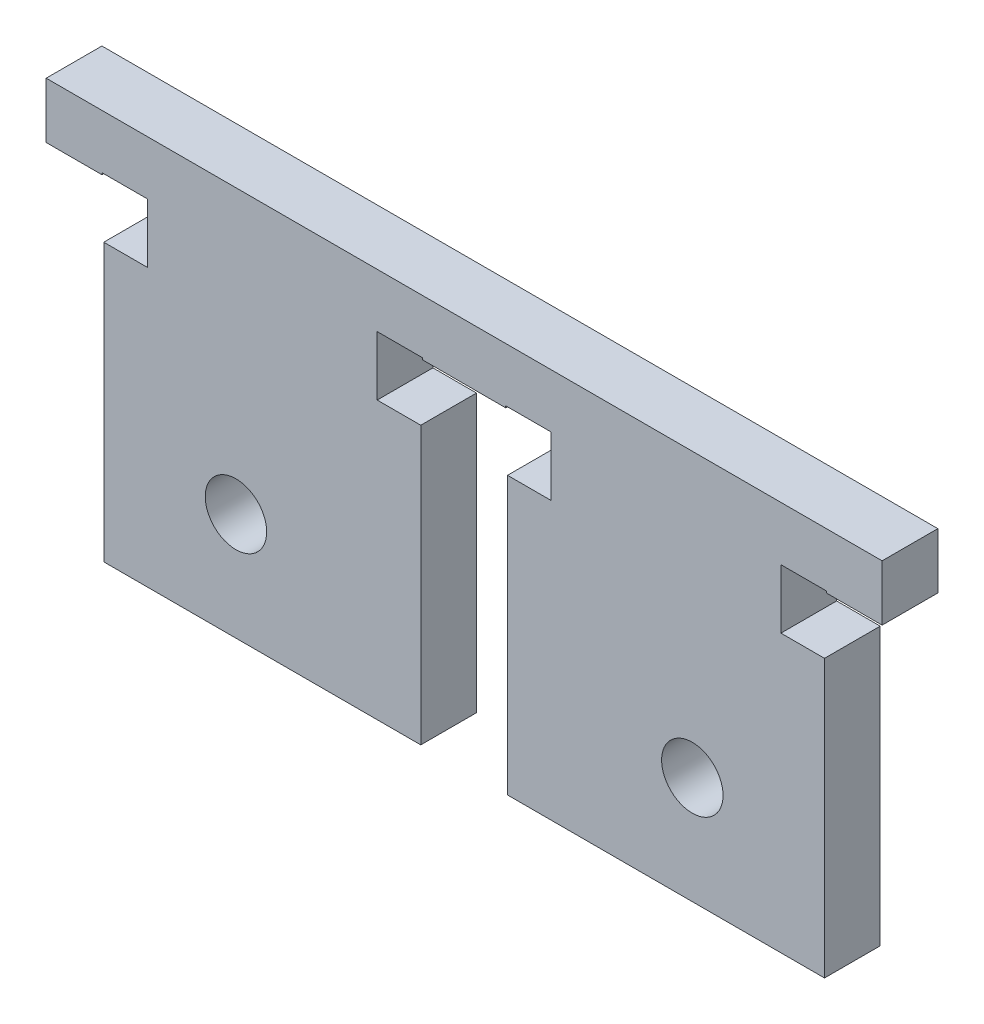
ISO-10303-21;
HEADER;
FILE_DESCRIPTION(('STEP AP214'),'2;1');
FILE_NAME('part.step','',(''),(''),'','','');
FILE_SCHEMA(('AUTOMOTIVE_DESIGN { 1 0 10303 214 1 1 1 1 }'));
ENDSEC;
DATA;
#1=APPLICATION_CONTEXT('core data for automotive mechanical design processes');
#2=APPLICATION_PROTOCOL_DEFINITION('international standard','automotive_design',2000,#1);
#3=PRODUCT_CONTEXT('',#1,'mechanical');
#4=PRODUCT('Part','Part','',(#3));
#5=PRODUCT_RELATED_PRODUCT_CATEGORY('part','',(#4));
#6=PRODUCT_DEFINITION_FORMATION('','',#4);
#7=PRODUCT_DEFINITION_CONTEXT('part definition',#1,'design');
#8=PRODUCT_DEFINITION('design','',#6,#7);
#9=PRODUCT_DEFINITION_SHAPE('','',#8);
#10=(LENGTH_UNIT() NAMED_UNIT(*) SI_UNIT(.MILLI.,.METRE.));
#11=(NAMED_UNIT(*) PLANE_ANGLE_UNIT() SI_UNIT($,.RADIAN.));
#12=(NAMED_UNIT(*) SI_UNIT($,.STERADIAN.) SOLID_ANGLE_UNIT());
#13=UNCERTAINTY_MEASURE_WITH_UNIT(LENGTH_MEASURE(1.E-05),#10,'distance_accuracy_value','');
#14=(GEOMETRIC_REPRESENTATION_CONTEXT(3) GLOBAL_UNCERTAINTY_ASSIGNED_CONTEXT((#13)) GLOBAL_UNIT_ASSIGNED_CONTEXT((#10,
#11,#12)) REPRESENTATION_CONTEXT('',''));
#15=CARTESIAN_POINT('',(0.,0.,0.));
#16=DIRECTION('',(0.,0.,1.));
#17=DIRECTION('',(1.,0.,0.));
#18=AXIS2_PLACEMENT_3D('',#15,#16,#17);
#19=CARTESIAN_POINT('',(0.,0.,6.35));
#20=DIRECTION('',(0.,0.,-1.));
#21=DIRECTION('',(-1.,0.,0.));
#22=AXIS2_PLACEMENT_3D('',#19,#20,#21);
#23=PLANE('',#22);
#24=CARTESIAN_POINT('',(-26.,-10.6279000000022,6.35));
#25=DIRECTION('',(0.,0.,1.));
#26=DIRECTION('',(1.,0.,0.));
#27=AXIS2_PLACEMENT_3D('',#24,#25,#26);
#28=CIRCLE('',#27,3.49999999999999);
#29=CARTESIAN_POINT('',(-22.5,-10.6279000000022,6.35));
#30=VERTEX_POINT('',#29);
#31=EDGE_CURVE('E695',#30,#30,#28,.T.);
#32=ORIENTED_EDGE('',*,*,#31,.F.);
#33=EDGE_LOOP('',(#32));
#34=FACE_BOUND('',#33,.T.);
#35=CARTESIAN_POINT('',(26.,-10.6279000000022,6.35));
#36=DIRECTION('',(0.,0.,1.));
#37=DIRECTION('',(1.,0.,0.));
#38=AXIS2_PLACEMENT_3D('',#35,#36,#37);
#39=CIRCLE('',#38,3.49999999999999);
#40=CARTESIAN_POINT('',(29.5,-10.6279000000022,6.35));
#41=VERTEX_POINT('',#40);
#42=EDGE_CURVE('E697',#41,#41,#39,.T.);
#43=ORIENTED_EDGE('',*,*,#42,.F.);
#44=EDGE_LOOP('',(#43));
#45=FACE_BOUND('',#44,.T.);
#46=DIRECTION('',(-1.,0.,0.));
#47=VECTOR('',#46,1.);
#48=CARTESIAN_POINT('',(-41.06164,-22.86,6.35));
#49=LINE('',#48,#47);
#50=CARTESIAN_POINT('',(41.06164,-22.86,6.35));
#51=VERTEX_POINT('',#50);
#52=CARTESIAN_POINT('',(4.94184939999999,-22.86,6.35));
#53=VERTEX_POINT('',#52);
#54=EDGE_CURVE('E58',#51,#53,#49,.T.);
#55=ORIENTED_EDGE('',*,*,#54,.F.);
#56=DIRECTION('',(0.,-1.,0.));
#57=VECTOR('',#56,1.);
#58=CARTESIAN_POINT('',(41.06164,0.,6.35));
#59=LINE('',#58,#57);
#60=CARTESIAN_POINT('',(41.06164,8.68679999999999,6.35));
#61=VERTEX_POINT('',#60);
#62=EDGE_CURVE('E271',#61,#51,#59,.T.);
#63=ORIENTED_EDGE('',*,*,#62,.F.);
#64=DIRECTION('',(-1.,0.,0.));
#65=VECTOR('',#64,1.);
#66=CARTESIAN_POINT('',(0.,8.68679999999999,6.35));
#67=LINE('',#66,#65);
#68=CARTESIAN_POINT('',(36.09594,8.68679999999999,6.35));
#69=VERTEX_POINT('',#68);
#70=EDGE_CURVE('E368',#61,#69,#67,.T.);
#71=ORIENTED_EDGE('',*,*,#70,.T.);
#72=DIRECTION('',(0.,-1.,0.));
#73=VECTOR('',#72,1.);
#74=CARTESIAN_POINT('',(36.09594,0.,6.35));
#75=LINE('',#74,#73);
#76=CARTESIAN_POINT('',(36.09594,15.4432,6.35));
#77=VERTEX_POINT('',#76);
#78=EDGE_CURVE('E365',#77,#69,#75,.T.);
#79=ORIENTED_EDGE('',*,*,#78,.F.);
#80=DIRECTION('',(-1.,0.,0.));
#81=VECTOR('',#80,1.);
#82=CARTESIAN_POINT('',(0.,15.4432,6.35));
#83=LINE('',#82,#81);
#84=CARTESIAN_POINT('',(41.26484,15.4432,6.35));
#85=VERTEX_POINT('',#84);
#86=EDGE_CURVE('E357',#85,#77,#83,.T.);
#87=ORIENTED_EDGE('',*,*,#86,.F.);
#88=DIRECTION('',(0.,-1.,0.));
#89=VECTOR('',#88,1.);
#90=CARTESIAN_POINT('',(41.26484,0.,6.35));
#91=LINE('',#90,#89);
#92=CARTESIAN_POINT('',(41.26484,15.24,6.35));
#93=VERTEX_POINT('',#92);
#94=EDGE_CURVE('E372',#85,#93,#91,.T.);
#95=ORIENTED_EDGE('',*,*,#94,.T.);
#96=DIRECTION('',(1.,0.,0.));
#97=VECTOR('',#96,1.);
#98=CARTESIAN_POINT('',(0.,15.24,6.35));
#99=LINE('',#98,#97);
#100=CARTESIAN_POINT('',(47.625,15.24,6.35));
#101=VERTEX_POINT('',#100);
#102=EDGE_CURVE('E273',#93,#101,#99,.T.);
#103=ORIENTED_EDGE('',*,*,#102,.T.);
#104=DIRECTION('',(0.,1.,0.));
#105=VECTOR('',#104,1.);
#106=CARTESIAN_POINT('',(47.625,-30.48,6.35));
#107=LINE('',#106,#105);
#108=CARTESIAN_POINT('',(47.625,21.59,6.35));
#109=VERTEX_POINT('',#108);
#110=EDGE_CURVE('E293',#101,#109,#107,.T.);
#111=ORIENTED_EDGE('',*,*,#110,.T.);
#112=DIRECTION('',(1.,0.,0.));
#113=VECTOR('',#112,1.);
#114=CARTESIAN_POINT('',(-47.625,21.59,6.35));
#115=LINE('',#114,#113);
#116=CARTESIAN_POINT('',(-47.625,21.59,6.35));
#117=VERTEX_POINT('',#116);
#118=EDGE_CURVE('E510',#117,#109,#115,.T.);
#119=ORIENTED_EDGE('',*,*,#118,.F.);
#120=DIRECTION('',(0.,-1.,0.));
#121=VECTOR('',#120,1.);
#122=CARTESIAN_POINT('',(-47.625,-30.48,6.35));
#123=LINE('',#122,#121);
#124=CARTESIAN_POINT('',(-47.625,15.24,6.35));
#125=VERTEX_POINT('',#124);
#126=EDGE_CURVE('E296',#117,#125,#123,.T.);
#127=ORIENTED_EDGE('',*,*,#126,.T.);
#128=DIRECTION('',(1.,0.,0.));
#129=VECTOR('',#128,1.);
#130=CARTESIAN_POINT('',(0.,15.24,6.35));
#131=LINE('',#130,#129);
#132=CARTESIAN_POINT('',(-41.26484,15.24,6.35));
#133=VERTEX_POINT('',#132);
#134=EDGE_CURVE('E251',#125,#133,#131,.T.);
#135=ORIENTED_EDGE('',*,*,#134,.T.);
#136=DIRECTION('',(0.,-1.,0.));
#137=VECTOR('',#136,1.);
#138=CARTESIAN_POINT('',(-41.26484,0.,6.35));
#139=LINE('',#138,#137);
#140=CARTESIAN_POINT('',(-41.26484,15.4432,6.35));
#141=VERTEX_POINT('',#140);
#142=EDGE_CURVE('E424',#141,#133,#139,.T.);
#143=ORIENTED_EDGE('',*,*,#142,.F.);
#144=DIRECTION('',(1.,0.,0.));
#145=VECTOR('',#144,1.);
#146=CARTESIAN_POINT('',(0.,15.4432,6.35));
#147=LINE('',#146,#145);
#148=CARTESIAN_POINT('',(-36.09594,15.4432,6.35));
#149=VERTEX_POINT('',#148);
#150=EDGE_CURVE('E421',#141,#149,#147,.T.);
#151=ORIENTED_EDGE('',*,*,#150,.T.);
#152=DIRECTION('',(0.,-1.,0.));
#153=VECTOR('',#152,1.);
#154=CARTESIAN_POINT('',(-36.09594,0.,6.35));
#155=LINE('',#154,#153);
#156=CARTESIAN_POINT('',(-36.09594,8.68679999999999,6.35));
#157=VERTEX_POINT('',#156);
#158=EDGE_CURVE('E347',#149,#157,#155,.T.);
#159=ORIENTED_EDGE('',*,*,#158,.T.);
#160=DIRECTION('',(1.,0.,0.));
#161=VECTOR('',#160,1.);
#162=CARTESIAN_POINT('',(0.,8.68679999999999,6.35));
#163=LINE('',#162,#161);
#164=CARTESIAN_POINT('',(-41.06164,8.68679999999999,6.35));
#165=VERTEX_POINT('',#164);
#166=EDGE_CURVE('E412',#165,#157,#163,.T.);
#167=ORIENTED_EDGE('',*,*,#166,.F.);
#168=DIRECTION('',(0.,-1.,0.));
#169=VECTOR('',#168,1.);
#170=CARTESIAN_POINT('',(-41.06164,0.,6.35));
#171=LINE('',#170,#169);
#172=CARTESIAN_POINT('',(-41.06164,-22.86,6.35));
#173=VERTEX_POINT('',#172);
#174=EDGE_CURVE('E257',#165,#173,#171,.T.);
#175=ORIENTED_EDGE('',*,*,#174,.T.);
#176=CARTESIAN_POINT('',(-4.94184940000002,-22.86,6.35));
#177=VERTEX_POINT('',#176);
#178=EDGE_CURVE('E66',#177,#173,#49,.T.);
#179=ORIENTED_EDGE('',*,*,#178,.F.);
#180=DIRECTION('',(0.,1.,0.));
#181=VECTOR('',#180,1.);
#182=CARTESIAN_POINT('',(-4.94184940000001,0.,6.35));
#183=LINE('',#182,#181);
#184=CARTESIAN_POINT('',(-4.94184940000001,8.68680000000001,6.35));
#185=VERTEX_POINT('',#184);
#186=EDGE_CURVE('E282',#177,#185,#183,.T.);
#187=ORIENTED_EDGE('',*,*,#186,.T.);
#188=DIRECTION('',(-1.,0.,0.));
#189=VECTOR('',#188,1.);
#190=CARTESIAN_POINT('',(0.,8.68680000000001,6.35));
#191=LINE('',#190,#189);
#192=CARTESIAN_POINT('',(-9.90754940000001,8.68680000000001,6.35));
#193=VERTEX_POINT('',#192);
#194=EDGE_CURVE('E384',#185,#193,#191,.T.);
#195=ORIENTED_EDGE('',*,*,#194,.T.);
#196=DIRECTION('',(0.,-1.,0.));
#197=VECTOR('',#196,1.);
#198=CARTESIAN_POINT('',(-9.90754940000001,0.,6.35));
#199=LINE('',#198,#197);
#200=CARTESIAN_POINT('',(-9.90754940000001,15.4432,6.35));
#201=VERTEX_POINT('',#200);
#202=EDGE_CURVE('E400',#201,#193,#199,.T.);
#203=ORIENTED_EDGE('',*,*,#202,.F.);
#204=DIRECTION('',(-1.,0.,0.));
#205=VECTOR('',#204,1.);
#206=CARTESIAN_POINT('',(0.,15.4432,6.35));
#207=LINE('',#206,#205);
#208=CARTESIAN_POINT('',(-4.73864940000001,15.4432,6.35));
#209=VERTEX_POINT('',#208);
#210=EDGE_CURVE('E396',#209,#201,#207,.T.);
#211=ORIENTED_EDGE('',*,*,#210,.F.);
#212=DIRECTION('',(0.,-1.,0.));
#213=VECTOR('',#212,1.);
#214=CARTESIAN_POINT('',(-4.73864940000001,0.,6.35));
#215=LINE('',#214,#213);
#216=CARTESIAN_POINT('',(-4.73864940000001,15.24,6.35));
#217=VERTEX_POINT('',#216);
#218=EDGE_CURVE('E393',#209,#217,#215,.T.);
#219=ORIENTED_EDGE('',*,*,#218,.T.);
#220=DIRECTION('',(1.,0.,0.));
#221=VECTOR('',#220,1.);
#222=CARTESIAN_POINT('',(0.,15.24,6.35));
#223=LINE('',#222,#221);
#224=CARTESIAN_POINT('',(4.73864940000001,15.24,6.35));
#225=VERTEX_POINT('',#224);
#226=EDGE_CURVE('E288',#217,#225,#223,.T.);
#227=ORIENTED_EDGE('',*,*,#226,.T.);
#228=DIRECTION('',(0.,-1.,0.));
#229=VECTOR('',#228,1.);
#230=CARTESIAN_POINT('',(4.73864940000001,0.,6.35));
#231=LINE('',#230,#229);
#232=CARTESIAN_POINT('',(4.73864940000001,15.4432,6.35));
#233=VERTEX_POINT('',#232);
#234=EDGE_CURVE('E335',#233,#225,#231,.T.);
#235=ORIENTED_EDGE('',*,*,#234,.F.);
#236=DIRECTION('',(1.,0.,0.));
#237=VECTOR('',#236,1.);
#238=CARTESIAN_POINT('',(0.,15.4432,6.35));
#239=LINE('',#238,#237);
#240=CARTESIAN_POINT('',(9.90754940000001,15.4432,6.35));
#241=VERTEX_POINT('',#240);
#242=EDGE_CURVE('E337',#233,#241,#239,.T.);
#243=ORIENTED_EDGE('',*,*,#242,.T.);
#244=DIRECTION('',(0.,-1.,0.));
#245=VECTOR('',#244,1.);
#246=CARTESIAN_POINT('',(9.90754940000001,0.,6.35));
#247=LINE('',#246,#245);
#248=CARTESIAN_POINT('',(9.90754940000001,8.68680000000001,6.35));
#249=VERTEX_POINT('',#248);
#250=EDGE_CURVE('E334',#241,#249,#247,.T.);
#251=ORIENTED_EDGE('',*,*,#250,.T.);
#252=DIRECTION('',(1.,0.,0.));
#253=VECTOR('',#252,1.);
#254=CARTESIAN_POINT('',(0.,8.68680000000001,6.35));
#255=LINE('',#254,#253);
#256=CARTESIAN_POINT('',(4.94184939999999,8.68680000000001,6.35));
#257=VERTEX_POINT('',#256);
#258=EDGE_CURVE('E326',#257,#249,#255,.T.);
#259=ORIENTED_EDGE('',*,*,#258,.F.);
#260=DIRECTION('',(0.,1.,0.));
#261=VECTOR('',#260,1.);
#262=CARTESIAN_POINT('',(4.94184939999999,0.,6.35));
#263=LINE('',#262,#261);
#264=EDGE_CURVE('E286',#53,#257,#263,.T.);
#265=ORIENTED_EDGE('',*,*,#264,.F.);
#266=EDGE_LOOP('',(#55,#63,#71,#79,#87,#95,#103,#111,#119,#127,#135,#143,#151,#159,#167,#175,
#179,#187,#195,#203,#211,#219,#227,#235,#243,#251,#259,#265));
#267=FACE_BOUND('',#266,.T.);
#268=ADVANCED_FACE('F43',(#34,#45,#267),#23,.F.);
#269=CARTESIAN_POINT('',(0.,0.,0.));
#270=DIRECTION('',(0.,0.,-1.));
#271=DIRECTION('',(-1.,0.,0.));
#272=AXIS2_PLACEMENT_3D('',#269,#270,#271);
#273=PLANE('',#272);
#274=CARTESIAN_POINT('',(-26.,-10.6279000000022,0.));
#275=DIRECTION('',(0.,0.,1.));
#276=DIRECTION('',(1.,0.,0.));
#277=AXIS2_PLACEMENT_3D('',#274,#275,#276);
#278=CIRCLE('',#277,3.5);
#279=CARTESIAN_POINT('',(-22.5,-10.6279000000022,0.));
#280=VERTEX_POINT('',#279);
#281=EDGE_CURVE('E693',#280,#280,#278,.T.);
#282=ORIENTED_EDGE('',*,*,#281,.T.);
#283=EDGE_LOOP('',(#282));
#284=FACE_BOUND('',#283,.T.);
#285=CARTESIAN_POINT('',(26.,-10.6279000000022,0.));
#286=DIRECTION('',(0.,0.,1.));
#287=DIRECTION('',(1.,0.,0.));
#288=AXIS2_PLACEMENT_3D('',#285,#286,#287);
#289=CIRCLE('',#288,3.5);
#290=CARTESIAN_POINT('',(29.5,-10.6279000000022,0.));
#291=VERTEX_POINT('',#290);
#292=EDGE_CURVE('E234',#291,#291,#289,.T.);
#293=ORIENTED_EDGE('',*,*,#292,.T.);
#294=EDGE_LOOP('',(#293));
#295=FACE_BOUND('',#294,.T.);
#296=DIRECTION('',(0.,-1.,0.));
#297=VECTOR('',#296,1.);
#298=CARTESIAN_POINT('',(41.06164,0.,0.));
#299=LINE('',#298,#297);
#300=CARTESIAN_POINT('',(41.06164,8.68679999999999,0.));
#301=VERTEX_POINT('',#300);
#302=CARTESIAN_POINT('',(41.06164,-22.86,0.));
#303=VERTEX_POINT('',#302);
#304=EDGE_CURVE('E270',#301,#303,#299,.T.);
#305=ORIENTED_EDGE('',*,*,#304,.T.);
#306=DIRECTION('',(1.,0.,0.));
#307=VECTOR('',#306,1.);
#308=CARTESIAN_POINT('',(-41.06164,-22.86,0.));
#309=LINE('',#308,#307);
#310=CARTESIAN_POINT('',(4.94184939999998,-22.86,0.));
#311=VERTEX_POINT('',#310);
#312=EDGE_CURVE('E233',#311,#303,#309,.T.);
#313=ORIENTED_EDGE('',*,*,#312,.F.);
#314=DIRECTION('',(0.,1.,0.));
#315=VECTOR('',#314,1.);
#316=CARTESIAN_POINT('',(4.94184939999999,0.,0.));
#317=LINE('',#316,#315);
#318=CARTESIAN_POINT('',(4.94184939999999,8.68680000000001,0.));
#319=VERTEX_POINT('',#318);
#320=EDGE_CURVE('E279',#311,#319,#317,.T.);
#321=ORIENTED_EDGE('',*,*,#320,.T.);
#322=DIRECTION('',(1.,0.,0.));
#323=VECTOR('',#322,1.);
#324=CARTESIAN_POINT('',(0.,8.68680000000001,0.));
#325=LINE('',#324,#323);
#326=CARTESIAN_POINT('',(9.90754940000001,8.68680000000001,0.));
#327=VERTEX_POINT('',#326);
#328=EDGE_CURVE('E329',#319,#327,#325,.T.);
#329=ORIENTED_EDGE('',*,*,#328,.T.);
#330=DIRECTION('',(0.,-1.,0.));
#331=VECTOR('',#330,1.);
#332=CARTESIAN_POINT('',(9.90754940000001,0.,0.));
#333=LINE('',#332,#331);
#334=CARTESIAN_POINT('',(9.90754940000001,15.4432,0.));
#335=VERTEX_POINT('',#334);
#336=EDGE_CURVE('E487',#335,#327,#333,.T.);
#337=ORIENTED_EDGE('',*,*,#336,.F.);
#338=DIRECTION('',(1.,0.,0.));
#339=VECTOR('',#338,1.);
#340=CARTESIAN_POINT('',(0.,15.4432,0.));
#341=LINE('',#340,#339);
#342=CARTESIAN_POINT('',(4.73864940000001,15.4432,0.));
#343=VERTEX_POINT('',#342);
#344=EDGE_CURVE('E352',#343,#335,#341,.T.);
#345=ORIENTED_EDGE('',*,*,#344,.F.);
#346=DIRECTION('',(0.,-1.,0.));
#347=VECTOR('',#346,1.);
#348=CARTESIAN_POINT('',(4.73864940000001,0.,0.));
#349=LINE('',#348,#347);
#350=CARTESIAN_POINT('',(4.73864940000001,15.24,0.));
#351=VERTEX_POINT('',#350);
#352=EDGE_CURVE('E344',#343,#351,#349,.T.);
#353=ORIENTED_EDGE('',*,*,#352,.T.);
#354=DIRECTION('',(1.,0.,0.));
#355=VECTOR('',#354,1.);
#356=CARTESIAN_POINT('',(0.,15.24,0.));
#357=LINE('',#356,#355);
#358=CARTESIAN_POINT('',(-4.73864940000001,15.24,0.));
#359=VERTEX_POINT('',#358);
#360=EDGE_CURVE('E281',#359,#351,#357,.T.);
#361=ORIENTED_EDGE('',*,*,#360,.F.);
#362=DIRECTION('',(0.,-1.,0.));
#363=VECTOR('',#362,1.);
#364=CARTESIAN_POINT('',(-4.73864940000001,0.,0.));
#365=LINE('',#364,#363);
#366=CARTESIAN_POINT('',(-4.73864940000001,15.4432,0.));
#367=VERTEX_POINT('',#366);
#368=EDGE_CURVE('E381',#367,#359,#365,.T.);
#369=ORIENTED_EDGE('',*,*,#368,.F.);
#370=DIRECTION('',(-1.,0.,0.));
#371=VECTOR('',#370,1.);
#372=CARTESIAN_POINT('',(0.,15.4432,0.));
#373=LINE('',#372,#371);
#374=CARTESIAN_POINT('',(-9.90754940000001,15.4432,0.));
#375=VERTEX_POINT('',#374);
#376=EDGE_CURVE('E383',#367,#375,#373,.T.);
#377=ORIENTED_EDGE('',*,*,#376,.T.);
#378=DIRECTION('',(0.,-1.,0.));
#379=VECTOR('',#378,1.);
#380=CARTESIAN_POINT('',(-9.90754940000001,0.,0.));
#381=LINE('',#380,#379);
#382=CARTESIAN_POINT('',(-9.90754940000001,8.68680000000001,0.));
#383=VERTEX_POINT('',#382);
#384=EDGE_CURVE('E387',#375,#383,#381,.T.);
#385=ORIENTED_EDGE('',*,*,#384,.T.);
#386=DIRECTION('',(-1.,0.,0.));
#387=VECTOR('',#386,1.);
#388=CARTESIAN_POINT('',(0.,8.68680000000001,0.));
#389=LINE('',#388,#387);
#390=CARTESIAN_POINT('',(-4.94184940000001,8.68680000000001,0.));
#391=VERTEX_POINT('',#390);
#392=EDGE_CURVE('E390',#391,#383,#389,.T.);
#393=ORIENTED_EDGE('',*,*,#392,.F.);
#394=DIRECTION('',(0.,1.,0.));
#395=VECTOR('',#394,1.);
#396=CARTESIAN_POINT('',(-4.94184940000001,0.,0.));
#397=LINE('',#396,#395);
#398=CARTESIAN_POINT('',(-4.94184940000002,-22.86,0.));
#399=VERTEX_POINT('',#398);
#400=EDGE_CURVE('E244',#399,#391,#397,.T.);
#401=ORIENTED_EDGE('',*,*,#400,.F.);
#402=CARTESIAN_POINT('',(-41.06164,-22.86,0.));
#403=VERTEX_POINT('',#402);
#404=EDGE_CURVE('E227',#403,#399,#309,.T.);
#405=ORIENTED_EDGE('',*,*,#404,.F.);
#406=DIRECTION('',(0.,-1.,0.));
#407=VECTOR('',#406,1.);
#408=CARTESIAN_POINT('',(-41.06164,0.,0.));
#409=LINE('',#408,#407);
#410=CARTESIAN_POINT('',(-41.06164,8.68679999999999,0.));
#411=VERTEX_POINT('',#410);
#412=EDGE_CURVE('E242',#411,#403,#409,.T.);
#413=ORIENTED_EDGE('',*,*,#412,.F.);
#414=DIRECTION('',(1.,0.,0.));
#415=VECTOR('',#414,1.);
#416=CARTESIAN_POINT('',(0.,8.68679999999999,0.));
#417=LINE('',#416,#415);
#418=CARTESIAN_POINT('',(-36.09594,8.68679999999999,0.));
#419=VERTEX_POINT('',#418);
#420=EDGE_CURVE('E417',#411,#419,#417,.T.);
#421=ORIENTED_EDGE('',*,*,#420,.T.);
#422=DIRECTION('',(0.,-1.,0.));
#423=VECTOR('',#422,1.);
#424=CARTESIAN_POINT('',(-36.09594,0.,0.));
#425=LINE('',#424,#423);
#426=CARTESIAN_POINT('',(-36.09594,15.4432,0.));
#427=VERTEX_POINT('',#426);
#428=EDGE_CURVE('E409',#427,#419,#425,.T.);
#429=ORIENTED_EDGE('',*,*,#428,.F.);
#430=DIRECTION('',(1.,0.,0.));
#431=VECTOR('',#430,1.);
#432=CARTESIAN_POINT('',(0.,15.4432,0.));
#433=LINE('',#432,#431);
#434=CARTESIAN_POINT('',(-41.26484,15.4432,0.));
#435=VERTEX_POINT('',#434);
#436=EDGE_CURVE('E411',#435,#427,#433,.T.);
#437=ORIENTED_EDGE('',*,*,#436,.F.);
#438=DIRECTION('',(0.,-1.,0.));
#439=VECTOR('',#438,1.);
#440=CARTESIAN_POINT('',(-41.26484,0.,0.));
#441=LINE('',#440,#439);
#442=CARTESIAN_POINT('',(-41.26484,15.24,0.));
#443=VERTEX_POINT('',#442);
#444=EDGE_CURVE('E414',#435,#443,#441,.T.);
#445=ORIENTED_EDGE('',*,*,#444,.T.);
#446=DIRECTION('',(1.,0.,0.));
#447=VECTOR('',#446,1.);
#448=CARTESIAN_POINT('',(0.,15.24,0.));
#449=LINE('',#448,#447);
#450=CARTESIAN_POINT('',(-47.625,15.24,0.));
#451=VERTEX_POINT('',#450);
#452=EDGE_CURVE('E250',#451,#443,#449,.T.);
#453=ORIENTED_EDGE('',*,*,#452,.F.);
#454=DIRECTION('',(0.,-1.,0.));
#455=VECTOR('',#454,1.);
#456=CARTESIAN_POINT('',(-47.625,-30.48,0.));
#457=LINE('',#456,#455);
#458=CARTESIAN_POINT('',(-47.625,21.59,0.));
#459=VERTEX_POINT('',#458);
#460=EDGE_CURVE('E297',#459,#451,#457,.T.);
#461=ORIENTED_EDGE('',*,*,#460,.F.);
#462=DIRECTION('',(-1.,0.,0.));
#463=VECTOR('',#462,1.);
#464=CARTESIAN_POINT('',(-47.625,21.59,0.));
#465=LINE('',#464,#463);
#466=CARTESIAN_POINT('',(47.625,21.59,0.));
#467=VERTEX_POINT('',#466);
#468=EDGE_CURVE('E369',#467,#459,#465,.T.);
#469=ORIENTED_EDGE('',*,*,#468,.F.);
#470=DIRECTION('',(0.,1.,0.));
#471=VECTOR('',#470,1.);
#472=CARTESIAN_POINT('',(47.625,-30.48,0.));
#473=LINE('',#472,#471);
#474=CARTESIAN_POINT('',(47.625,15.24,0.));
#475=VERTEX_POINT('',#474);
#476=EDGE_CURVE('E267',#475,#467,#473,.T.);
#477=ORIENTED_EDGE('',*,*,#476,.F.);
#478=DIRECTION('',(1.,0.,0.));
#479=VECTOR('',#478,1.);
#480=CARTESIAN_POINT('',(0.,15.24,0.));
#481=LINE('',#480,#479);
#482=CARTESIAN_POINT('',(41.26484,15.24,0.));
#483=VERTEX_POINT('',#482);
#484=EDGE_CURVE('E268',#483,#475,#481,.T.);
#485=ORIENTED_EDGE('',*,*,#484,.F.);
#486=DIRECTION('',(0.,-1.,0.));
#487=VECTOR('',#486,1.);
#488=CARTESIAN_POINT('',(41.26484,0.,0.));
#489=LINE('',#488,#487);
#490=CARTESIAN_POINT('',(41.26484,15.4432,0.));
#491=VERTEX_POINT('',#490);
#492=EDGE_CURVE('E359',#491,#483,#489,.T.);
#493=ORIENTED_EDGE('',*,*,#492,.F.);
#494=DIRECTION('',(-1.,0.,0.));
#495=VECTOR('',#494,1.);
#496=CARTESIAN_POINT('',(0.,15.4432,0.));
#497=LINE('',#496,#495);
#498=CARTESIAN_POINT('',(36.09594,15.4432,0.));
#499=VERTEX_POINT('',#498);
#500=EDGE_CURVE('E361',#491,#499,#497,.T.);
#501=ORIENTED_EDGE('',*,*,#500,.T.);
#502=DIRECTION('',(0.,-1.,0.));
#503=VECTOR('',#502,1.);
#504=CARTESIAN_POINT('',(36.09594,0.,0.));
#505=LINE('',#504,#503);
#506=CARTESIAN_POINT('',(36.09594,8.68679999999999,0.));
#507=VERTEX_POINT('',#506);
#508=EDGE_CURVE('E353',#499,#507,#505,.T.);
#509=ORIENTED_EDGE('',*,*,#508,.T.);
#510=DIRECTION('',(-1.,0.,0.));
#511=VECTOR('',#510,1.);
#512=CARTESIAN_POINT('',(0.,8.68679999999999,0.));
#513=LINE('',#512,#511);
#514=EDGE_CURVE('E356',#301,#507,#513,.T.);
#515=ORIENTED_EDGE('',*,*,#514,.F.);
#516=EDGE_LOOP('',(#305,#313,#321,#329,#337,#345,#353,#361,#369,#377,#385,#393,#401,#405,#413,
#421,#429,#437,#445,#453,#461,#469,#477,#485,#493,#501,#509,#515));
#517=FACE_BOUND('',#516,.T.);
#518=ADVANCED_FACE('F240',(#284,#295,#517),#273,.T.);
#519=CARTESIAN_POINT('',(41.06164,0.,0.));
#520=DIRECTION('',(-1.,0.,0.));
#521=DIRECTION('',(0.,-1.,0.));
#522=AXIS2_PLACEMENT_3D('',#519,#520,#521);
#523=PLANE('',#522);
#524=DIRECTION('',(0.,0.,1.));
#525=VECTOR('',#524,1.);
#526=CARTESIAN_POINT('',(41.06164,-22.86,6.35));
#527=LINE('',#526,#525);
#528=EDGE_CURVE('E245',#303,#51,#527,.T.);
#529=ORIENTED_EDGE('',*,*,#528,.F.);
#530=ORIENTED_EDGE('',*,*,#304,.F.);
#531=DIRECTION('',(0.,0.,-1.));
#532=VECTOR('',#531,1.);
#533=CARTESIAN_POINT('',(41.06164,8.68679999999999,0.));
#534=LINE('',#533,#532);
#535=EDGE_CURVE('E311',#61,#301,#534,.T.);
#536=ORIENTED_EDGE('',*,*,#535,.F.);
#537=ORIENTED_EDGE('',*,*,#62,.T.);
#538=EDGE_LOOP('',(#529,#530,#536,#537));
#539=FACE_BOUND('',#538,.T.);
#540=ADVANCED_FACE('F546',(#539),#523,.F.);
#541=CARTESIAN_POINT('',(-4.94184940000001,0.,0.));
#542=DIRECTION('',(1.,0.,0.));
#543=DIRECTION('',(0.,0.,-1.));
#544=AXIS2_PLACEMENT_3D('',#541,#542,#543);
#545=PLANE('',#544);
#546=ORIENTED_EDGE('',*,*,#186,.F.);
#547=DIRECTION('',(0.,0.,-1.));
#548=VECTOR('',#547,1.);
#549=CARTESIAN_POINT('',(-4.94184940000001,-22.86,0.));
#550=LINE('',#549,#548);
#551=EDGE_CURVE('E459',#177,#399,#550,.T.);
#552=ORIENTED_EDGE('',*,*,#551,.T.);
#553=ORIENTED_EDGE('',*,*,#400,.T.);
#554=DIRECTION('',(0.,0.,1.));
#555=VECTOR('',#554,1.);
#556=CARTESIAN_POINT('',(-4.94184940000001,8.68680000000001,0.));
#557=LINE('',#556,#555);
#558=EDGE_CURVE('E308',#391,#185,#557,.T.);
#559=ORIENTED_EDGE('',*,*,#558,.T.);
#560=EDGE_LOOP('',(#546,#552,#553,#559));
#561=FACE_BOUND('',#560,.T.);
#562=ADVANCED_FACE('F458',(#561),#545,.T.);
#563=CARTESIAN_POINT('',(4.94184939999999,0.,0.));
#564=DIRECTION('',(1.,0.,0.));
#565=DIRECTION('',(0.,0.,-1.));
#566=AXIS2_PLACEMENT_3D('',#563,#564,#565);
#567=PLANE('',#566);
#568=DIRECTION('',(0.,0.,-1.));
#569=VECTOR('',#568,1.);
#570=CARTESIAN_POINT('',(4.94184939999999,-22.86,0.));
#571=LINE('',#570,#569);
#572=EDGE_CURVE('E505',#53,#311,#571,.T.);
#573=ORIENTED_EDGE('',*,*,#572,.F.);
#574=ORIENTED_EDGE('',*,*,#264,.T.);
#575=DIRECTION('',(0.,0.,-1.));
#576=VECTOR('',#575,1.);
#577=CARTESIAN_POINT('',(4.94184939999999,8.68680000000001,0.));
#578=LINE('',#577,#576);
#579=EDGE_CURVE('E51',#257,#319,#578,.T.);
#580=ORIENTED_EDGE('',*,*,#579,.T.);
#581=ORIENTED_EDGE('',*,*,#320,.F.);
#582=EDGE_LOOP('',(#573,#574,#580,#581));
#583=FACE_BOUND('',#582,.T.);
#584=ADVANCED_FACE('F319',(#583),#567,.F.);
#585=CARTESIAN_POINT('',(-41.06164,0.,0.));
#586=DIRECTION('',(-1.,0.,0.));
#587=DIRECTION('',(0.,-1.,0.));
#588=AXIS2_PLACEMENT_3D('',#585,#586,#587);
#589=PLANE('',#588);
#590=ORIENTED_EDGE('',*,*,#412,.T.);
#591=DIRECTION('',(0.,0.,-1.));
#592=VECTOR('',#591,1.);
#593=CARTESIAN_POINT('',(-41.06164,-22.86,6.35));
#594=LINE('',#593,#592);
#595=EDGE_CURVE('E224',#173,#403,#594,.T.);
#596=ORIENTED_EDGE('',*,*,#595,.F.);
#597=ORIENTED_EDGE('',*,*,#174,.F.);
#598=DIRECTION('',(0.,0.,1.));
#599=VECTOR('',#598,1.);
#600=CARTESIAN_POINT('',(-41.06164,8.68679999999999,0.));
#601=LINE('',#600,#599);
#602=EDGE_CURVE('E249',#411,#165,#601,.T.);
#603=ORIENTED_EDGE('',*,*,#602,.F.);
#604=EDGE_LOOP('',(#590,#596,#597,#603));
#605=FACE_BOUND('',#604,.T.);
#606=ADVANCED_FACE('F248',(#605),#589,.T.);
#607=CARTESIAN_POINT('',(47.625,-30.48,6.35));
#608=DIRECTION('',(-1.,0.,0.));
#609=DIRECTION('',(0.,0.,1.));
#610=AXIS2_PLACEMENT_3D('',#607,#608,#609);
#611=PLANE('',#610);
#612=DIRECTION('',(0.,0.,-1.));
#613=VECTOR('',#612,1.);
#614=CARTESIAN_POINT('',(47.625,21.59,0.));
#615=LINE('',#614,#613);
#616=EDGE_CURVE('E511',#109,#467,#615,.T.);
#617=ORIENTED_EDGE('',*,*,#616,.F.);
#618=ORIENTED_EDGE('',*,*,#110,.F.);
#619=DIRECTION('',(0.,0.,1.));
#620=VECTOR('',#619,1.);
#621=CARTESIAN_POINT('',(47.625,15.24,0.));
#622=LINE('',#621,#620);
#623=EDGE_CURVE('E263',#475,#101,#622,.T.);
#624=ORIENTED_EDGE('',*,*,#623,.F.);
#625=ORIENTED_EDGE('',*,*,#476,.T.);
#626=EDGE_LOOP('',(#617,#618,#624,#625));
#627=FACE_BOUND('',#626,.T.);
#628=ADVANCED_FACE('F45',(#627),#611,.F.);
#629=CARTESIAN_POINT('',(-47.625,-30.48,6.35));
#630=DIRECTION('',(1.,0.,0.));
#631=DIRECTION('',(0.,0.,-1.));
#632=AXIS2_PLACEMENT_3D('',#629,#630,#631);
#633=PLANE('',#632);
#634=DIRECTION('',(0.,0.,1.));
#635=VECTOR('',#634,1.);
#636=CARTESIAN_POINT('',(-47.625,21.59,0.));
#637=LINE('',#636,#635);
#638=EDGE_CURVE('E508',#459,#117,#637,.T.);
#639=ORIENTED_EDGE('',*,*,#638,.F.);
#640=ORIENTED_EDGE('',*,*,#460,.T.);
#641=DIRECTION('',(0.,0.,1.));
#642=VECTOR('',#641,1.);
#643=CARTESIAN_POINT('',(-47.625,15.24,0.));
#644=LINE('',#643,#642);
#645=EDGE_CURVE('E254',#451,#125,#644,.T.);
#646=ORIENTED_EDGE('',*,*,#645,.T.);
#647=ORIENTED_EDGE('',*,*,#126,.F.);
#648=EDGE_LOOP('',(#639,#640,#646,#647));
#649=FACE_BOUND('',#648,.T.);
#650=ADVANCED_FACE('F520',(#649),#633,.F.);
#651=CARTESIAN_POINT('',(0.,15.24,0.));
#652=DIRECTION('',(0.,-1.,0.));
#653=DIRECTION('',(1.,0.,0.));
#654=AXIS2_PLACEMENT_3D('',#651,#652,#653);
#655=PLANE('',#654);
#656=ORIENTED_EDGE('',*,*,#102,.F.);
#657=DIRECTION('',(0.,0.,-1.));
#658=VECTOR('',#657,1.);
#659=CARTESIAN_POINT('',(41.26484,15.24,0.));
#660=LINE('',#659,#658);
#661=EDGE_CURVE('E313',#93,#483,#660,.T.);
#662=ORIENTED_EDGE('',*,*,#661,.T.);
#663=ORIENTED_EDGE('',*,*,#484,.T.);
#664=ORIENTED_EDGE('',*,*,#623,.T.);
#665=EDGE_LOOP('',(#656,#662,#663,#664));
#666=FACE_BOUND('',#665,.T.);
#667=ADVANCED_FACE('F528',(#666),#655,.T.);
#668=CARTESIAN_POINT('',(0.,15.24,0.));
#669=DIRECTION('',(0.,-1.,0.));
#670=DIRECTION('',(1.,0.,0.));
#671=AXIS2_PLACEMENT_3D('',#668,#669,#670);
#672=PLANE('',#671);
#673=DIRECTION('',(0.,0.,-1.));
#674=VECTOR('',#673,1.);
#675=CARTESIAN_POINT('',(4.73864940000001,15.24,0.));
#676=LINE('',#675,#674);
#677=EDGE_CURVE('E11',#225,#351,#676,.T.);
#678=ORIENTED_EDGE('',*,*,#677,.F.);
#679=ORIENTED_EDGE('',*,*,#226,.F.);
#680=DIRECTION('',(0.,0.,-1.));
#681=VECTOR('',#680,1.);
#682=CARTESIAN_POINT('',(-4.73864940000001,15.24,0.));
#683=LINE('',#682,#681);
#684=EDGE_CURVE('E305',#217,#359,#683,.T.);
#685=ORIENTED_EDGE('',*,*,#684,.T.);
#686=ORIENTED_EDGE('',*,*,#360,.T.);
#687=EDGE_LOOP('',(#678,#679,#685,#686));
#688=FACE_BOUND('',#687,.T.);
#689=ADVANCED_FACE('F480',(#688),#672,.T.);
#690=CARTESIAN_POINT('',(0.,15.24,0.));
#691=DIRECTION('',(0.,-1.,0.));
#692=DIRECTION('',(1.,0.,0.));
#693=AXIS2_PLACEMENT_3D('',#690,#691,#692);
#694=PLANE('',#693);
#695=DIRECTION('',(0.,0.,-1.));
#696=VECTOR('',#695,1.);
#697=CARTESIAN_POINT('',(-41.26484,15.24,0.));
#698=LINE('',#697,#696);
#699=EDGE_CURVE('E299',#133,#443,#698,.T.);
#700=ORIENTED_EDGE('',*,*,#699,.F.);
#701=ORIENTED_EDGE('',*,*,#134,.F.);
#702=ORIENTED_EDGE('',*,*,#645,.F.);
#703=ORIENTED_EDGE('',*,*,#452,.T.);
#704=EDGE_LOOP('',(#700,#701,#702,#703));
#705=FACE_BOUND('',#704,.T.);
#706=ADVANCED_FACE('F447',(#705),#694,.T.);
#707=CARTESIAN_POINT('',(-36.09594,0.,0.));
#708=DIRECTION('',(-1.,0.,0.));
#709=DIRECTION('',(0.,0.,1.));
#710=AXIS2_PLACEMENT_3D('',#707,#708,#709);
#711=PLANE('',#710);
#712=ORIENTED_EDGE('',*,*,#158,.F.);
#713=DIRECTION('',(0.,0.,1.));
#714=VECTOR('',#713,1.);
#715=CARTESIAN_POINT('',(-36.09594,15.4432,0.));
#716=LINE('',#715,#714);
#717=EDGE_CURVE('E260',#427,#149,#716,.T.);
#718=ORIENTED_EDGE('',*,*,#717,.F.);
#719=ORIENTED_EDGE('',*,*,#428,.T.);
#720=DIRECTION('',(0.,0.,1.));
#721=VECTOR('',#720,1.);
#722=CARTESIAN_POINT('',(-36.09594,8.68679999999999,0.));
#723=LINE('',#722,#721);
#724=EDGE_CURVE('E397',#419,#157,#723,.T.);
#725=ORIENTED_EDGE('',*,*,#724,.T.);
#726=EDGE_LOOP('',(#712,#718,#719,#725));
#727=FACE_BOUND('',#726,.T.);
#728=ADVANCED_FACE('F440',(#727),#711,.T.);
#729=CARTESIAN_POINT('',(0.,8.68679999999999,0.));
#730=DIRECTION('',(0.,-1.,0.));
#731=DIRECTION('',(0.,0.,-1.));
#732=AXIS2_PLACEMENT_3D('',#729,#730,#731);
#733=PLANE('',#732);
#734=ORIENTED_EDGE('',*,*,#602,.T.);
#735=ORIENTED_EDGE('',*,*,#166,.T.);
#736=ORIENTED_EDGE('',*,*,#724,.F.);
#737=ORIENTED_EDGE('',*,*,#420,.F.);
#738=EDGE_LOOP('',(#734,#735,#736,#737));
#739=FACE_BOUND('',#738,.T.);
#740=ADVANCED_FACE('F453',(#739),#733,.F.);
#741=CARTESIAN_POINT('',(-41.26484,0.,0.));
#742=DIRECTION('',(-1.,0.,0.));
#743=DIRECTION('',(0.,0.,1.));
#744=AXIS2_PLACEMENT_3D('',#741,#742,#743);
#745=PLANE('',#744);
#746=ORIENTED_EDGE('',*,*,#699,.T.);
#747=ORIENTED_EDGE('',*,*,#444,.F.);
#748=DIRECTION('',(0.,0.,1.));
#749=VECTOR('',#748,1.);
#750=CARTESIAN_POINT('',(-41.26484,15.4432,0.));
#751=LINE('',#750,#749);
#752=EDGE_CURVE('E428',#435,#141,#751,.T.);
#753=ORIENTED_EDGE('',*,*,#752,.T.);
#754=ORIENTED_EDGE('',*,*,#142,.T.);
#755=EDGE_LOOP('',(#746,#747,#753,#754));
#756=FACE_BOUND('',#755,.T.);
#757=ADVANCED_FACE('F445',(#756),#745,.F.);
#758=CARTESIAN_POINT('',(0.,15.4432,0.));
#759=DIRECTION('',(0.,-1.,0.));
#760=DIRECTION('',(0.,0.,-1.));
#761=AXIS2_PLACEMENT_3D('',#758,#759,#760);
#762=PLANE('',#761);
#763=ORIENTED_EDGE('',*,*,#150,.F.);
#764=ORIENTED_EDGE('',*,*,#752,.F.);
#765=ORIENTED_EDGE('',*,*,#436,.T.);
#766=ORIENTED_EDGE('',*,*,#717,.T.);
#767=EDGE_LOOP('',(#763,#764,#765,#766));
#768=FACE_BOUND('',#767,.T.);
#769=ADVANCED_FACE('F435',(#768),#762,.T.);
#770=CARTESIAN_POINT('',(-4.73864940000001,0.,0.));
#771=DIRECTION('',(-1.,0.,0.));
#772=DIRECTION('',(0.,0.,1.));
#773=AXIS2_PLACEMENT_3D('',#770,#771,#772);
#774=PLANE('',#773);
#775=ORIENTED_EDGE('',*,*,#218,.F.);
#776=DIRECTION('',(0.,0.,1.));
#777=VECTOR('',#776,1.);
#778=CARTESIAN_POINT('',(-4.73864940000001,15.4432,0.));
#779=LINE('',#778,#777);
#780=EDGE_CURVE('E392',#367,#209,#779,.T.);
#781=ORIENTED_EDGE('',*,*,#780,.F.);
#782=ORIENTED_EDGE('',*,*,#368,.T.);
#783=ORIENTED_EDGE('',*,*,#684,.F.);
#784=EDGE_LOOP('',(#775,#781,#782,#783));
#785=FACE_BOUND('',#784,.T.);
#786=ADVANCED_FACE('F476',(#785),#774,.T.);
#787=CARTESIAN_POINT('',(0.,8.68680000000001,0.));
#788=DIRECTION('',(0.,1.,0.));
#789=DIRECTION('',(0.,0.,1.));
#790=AXIS2_PLACEMENT_3D('',#787,#788,#789);
#791=PLANE('',#790);
#792=ORIENTED_EDGE('',*,*,#392,.T.);
#793=DIRECTION('',(0.,0.,1.));
#794=VECTOR('',#793,1.);
#795=CARTESIAN_POINT('',(-9.90754940000001,8.68680000000001,0.));
#796=LINE('',#795,#794);
#797=EDGE_CURVE('E289',#383,#193,#796,.T.);
#798=ORIENTED_EDGE('',*,*,#797,.T.);
#799=ORIENTED_EDGE('',*,*,#194,.F.);
#800=ORIENTED_EDGE('',*,*,#558,.F.);
#801=EDGE_LOOP('',(#792,#798,#799,#800));
#802=FACE_BOUND('',#801,.T.);
#803=ADVANCED_FACE('F462',(#802),#791,.T.);
#804=CARTESIAN_POINT('',(-9.90754940000001,0.,0.));
#805=DIRECTION('',(-1.,0.,0.));
#806=DIRECTION('',(0.,0.,1.));
#807=AXIS2_PLACEMENT_3D('',#804,#805,#806);
#808=PLANE('',#807);
#809=ORIENTED_EDGE('',*,*,#202,.T.);
#810=ORIENTED_EDGE('',*,*,#797,.F.);
#811=ORIENTED_EDGE('',*,*,#384,.F.);
#812=DIRECTION('',(0.,0.,1.));
#813=VECTOR('',#812,1.);
#814=CARTESIAN_POINT('',(-9.90754940000001,15.4432,0.));
#815=LINE('',#814,#813);
#816=EDGE_CURVE('E406',#375,#201,#815,.T.);
#817=ORIENTED_EDGE('',*,*,#816,.T.);
#818=EDGE_LOOP('',(#809,#810,#811,#817));
#819=FACE_BOUND('',#818,.T.);
#820=ADVANCED_FACE('F468',(#819),#808,.F.);
#821=CARTESIAN_POINT('',(0.,15.4432,0.));
#822=DIRECTION('',(0.,1.,0.));
#823=DIRECTION('',(0.,0.,1.));
#824=AXIS2_PLACEMENT_3D('',#821,#822,#823);
#825=PLANE('',#824);
#826=ORIENTED_EDGE('',*,*,#210,.T.);
#827=ORIENTED_EDGE('',*,*,#816,.F.);
#828=ORIENTED_EDGE('',*,*,#376,.F.);
#829=ORIENTED_EDGE('',*,*,#780,.T.);
#830=EDGE_LOOP('',(#826,#827,#828,#829));
#831=FACE_BOUND('',#830,.T.);
#832=ADVANCED_FACE('F474',(#831),#825,.F.);
#833=CARTESIAN_POINT('',(0.,8.68679999999999,0.));
#834=DIRECTION('',(0.,1.,0.));
#835=DIRECTION('',(0.,0.,1.));
#836=AXIS2_PLACEMENT_3D('',#833,#834,#835);
#837=PLANE('',#836);
#838=ORIENTED_EDGE('',*,*,#535,.T.);
#839=ORIENTED_EDGE('',*,*,#514,.T.);
#840=DIRECTION('',(0.,0.,1.));
#841=VECTOR('',#840,1.);
#842=CARTESIAN_POINT('',(36.09594,8.68679999999999,0.));
#843=LINE('',#842,#841);
#844=EDGE_CURVE('E364',#507,#69,#843,.T.);
#845=ORIENTED_EDGE('',*,*,#844,.T.);
#846=ORIENTED_EDGE('',*,*,#70,.F.);
#847=EDGE_LOOP('',(#838,#839,#845,#846));
#848=FACE_BOUND('',#847,.T.);
#849=ADVANCED_FACE('F542',(#848),#837,.T.);
#850=CARTESIAN_POINT('',(36.09594,0.,0.));
#851=DIRECTION('',(-1.,0.,0.));
#852=DIRECTION('',(0.,0.,1.));
#853=AXIS2_PLACEMENT_3D('',#850,#851,#852);
#854=PLANE('',#853);
#855=ORIENTED_EDGE('',*,*,#78,.T.);
#856=ORIENTED_EDGE('',*,*,#844,.F.);
#857=ORIENTED_EDGE('',*,*,#508,.F.);
#858=DIRECTION('',(0.,0.,1.));
#859=VECTOR('',#858,1.);
#860=CARTESIAN_POINT('',(36.09594,15.4432,0.));
#861=LINE('',#860,#859);
#862=EDGE_CURVE('E339',#499,#77,#861,.T.);
#863=ORIENTED_EDGE('',*,*,#862,.T.);
#864=EDGE_LOOP('',(#855,#856,#857,#863));
#865=FACE_BOUND('',#864,.T.);
#866=ADVANCED_FACE('F540',(#865),#854,.F.);
#867=CARTESIAN_POINT('',(0.,15.4432,0.));
#868=DIRECTION('',(0.,1.,0.));
#869=DIRECTION('',(0.,0.,1.));
#870=AXIS2_PLACEMENT_3D('',#867,#868,#869);
#871=PLANE('',#870);
#872=ORIENTED_EDGE('',*,*,#86,.T.);
#873=ORIENTED_EDGE('',*,*,#862,.F.);
#874=ORIENTED_EDGE('',*,*,#500,.F.);
#875=DIRECTION('',(0.,0.,1.));
#876=VECTOR('',#875,1.);
#877=CARTESIAN_POINT('',(41.26484,15.4432,0.));
#878=LINE('',#877,#876);
#879=EDGE_CURVE('E378',#491,#85,#878,.T.);
#880=ORIENTED_EDGE('',*,*,#879,.T.);
#881=EDGE_LOOP('',(#872,#873,#874,#880));
#882=FACE_BOUND('',#881,.T.);
#883=ADVANCED_FACE('F535',(#882),#871,.F.);
#884=CARTESIAN_POINT('',(41.26484,0.,0.));
#885=DIRECTION('',(-1.,0.,0.));
#886=DIRECTION('',(0.,0.,1.));
#887=AXIS2_PLACEMENT_3D('',#884,#885,#886);
#888=PLANE('',#887);
#889=ORIENTED_EDGE('',*,*,#94,.F.);
#890=ORIENTED_EDGE('',*,*,#879,.F.);
#891=ORIENTED_EDGE('',*,*,#492,.T.);
#892=ORIENTED_EDGE('',*,*,#661,.F.);
#893=EDGE_LOOP('',(#889,#890,#891,#892));
#894=FACE_BOUND('',#893,.T.);
#895=ADVANCED_FACE('F531',(#894),#888,.T.);
#896=CARTESIAN_POINT('',(0.,8.68680000000001,0.));
#897=DIRECTION('',(0.,-1.,0.));
#898=DIRECTION('',(0.,0.,-1.));
#899=AXIS2_PLACEMENT_3D('',#896,#897,#898);
#900=PLANE('',#899);
#901=ORIENTED_EDGE('',*,*,#258,.T.);
#902=DIRECTION('',(0.,0.,1.));
#903=VECTOR('',#902,1.);
#904=CARTESIAN_POINT('',(9.90754940000001,8.68680000000001,0.));
#905=LINE('',#904,#903);
#906=EDGE_CURVE('E350',#327,#249,#905,.T.);
#907=ORIENTED_EDGE('',*,*,#906,.F.);
#908=ORIENTED_EDGE('',*,*,#328,.F.);
#909=ORIENTED_EDGE('',*,*,#579,.F.);
#910=EDGE_LOOP('',(#901,#907,#908,#909));
#911=FACE_BOUND('',#910,.T.);
#912=ADVANCED_FACE('F324',(#911),#900,.F.);
#913=CARTESIAN_POINT('',(4.73864940000001,0.,0.));
#914=DIRECTION('',(-1.,0.,0.));
#915=DIRECTION('',(0.,0.,1.));
#916=AXIS2_PLACEMENT_3D('',#913,#914,#915);
#917=PLANE('',#916);
#918=ORIENTED_EDGE('',*,*,#677,.T.);
#919=ORIENTED_EDGE('',*,*,#352,.F.);
#920=DIRECTION('',(0.,0.,1.));
#921=VECTOR('',#920,1.);
#922=CARTESIAN_POINT('',(4.73864940000001,15.4432,0.));
#923=LINE('',#922,#921);
#924=EDGE_CURVE('E345',#343,#233,#923,.T.);
#925=ORIENTED_EDGE('',*,*,#924,.T.);
#926=ORIENTED_EDGE('',*,*,#234,.T.);
#927=EDGE_LOOP('',(#918,#919,#925,#926));
#928=FACE_BOUND('',#927,.T.);
#929=ADVANCED_FACE('F624',(#928),#917,.F.);
#930=CARTESIAN_POINT('',(0.,15.4432,0.));
#931=DIRECTION('',(0.,-1.,0.));
#932=DIRECTION('',(0.,0.,-1.));
#933=AXIS2_PLACEMENT_3D('',#930,#931,#932);
#934=PLANE('',#933);
#935=ORIENTED_EDGE('',*,*,#242,.F.);
#936=ORIENTED_EDGE('',*,*,#924,.F.);
#937=ORIENTED_EDGE('',*,*,#344,.T.);
#938=DIRECTION('',(0.,0.,1.));
#939=VECTOR('',#938,1.);
#940=CARTESIAN_POINT('',(9.90754940000001,15.4432,0.));
#941=LINE('',#940,#939);
#942=EDGE_CURVE('E348',#335,#241,#941,.T.);
#943=ORIENTED_EDGE('',*,*,#942,.T.);
#944=EDGE_LOOP('',(#935,#936,#937,#943));
#945=FACE_BOUND('',#944,.T.);
#946=ADVANCED_FACE('F495',(#945),#934,.T.);
#947=CARTESIAN_POINT('',(9.90754940000001,0.,0.));
#948=DIRECTION('',(-1.,0.,0.));
#949=DIRECTION('',(0.,0.,1.));
#950=AXIS2_PLACEMENT_3D('',#947,#948,#949);
#951=PLANE('',#950);
#952=ORIENTED_EDGE('',*,*,#250,.F.);
#953=ORIENTED_EDGE('',*,*,#942,.F.);
#954=ORIENTED_EDGE('',*,*,#336,.T.);
#955=ORIENTED_EDGE('',*,*,#906,.T.);
#956=EDGE_LOOP('',(#952,#953,#954,#955));
#957=FACE_BOUND('',#956,.T.);
#958=ADVANCED_FACE('F497',(#957),#951,.T.);
#959=CARTESIAN_POINT('',(0.,21.59,0.));
#960=DIRECTION('',(0.,1.,0.));
#961=DIRECTION('',(0.,0.,1.));
#962=AXIS2_PLACEMENT_3D('',#959,#960,#961);
#963=PLANE('',#962);
#964=ORIENTED_EDGE('',*,*,#638,.T.);
#965=ORIENTED_EDGE('',*,*,#118,.T.);
#966=ORIENTED_EDGE('',*,*,#616,.T.);
#967=ORIENTED_EDGE('',*,*,#468,.T.);
#968=EDGE_LOOP('',(#964,#965,#966,#967));
#969=FACE_BOUND('',#968,.T.);
#970=ADVANCED_FACE('F515',(#969),#963,.T.);
#971=CARTESIAN_POINT('',(0.,-22.86,0.));
#972=DIRECTION('',(0.,-1.,0.));
#973=DIRECTION('',(0.,0.,-1.));
#974=AXIS2_PLACEMENT_3D('',#971,#972,#973);
#975=PLANE('',#974);
#976=ORIENTED_EDGE('',*,*,#178,.T.);
#977=ORIENTED_EDGE('',*,*,#595,.T.);
#978=ORIENTED_EDGE('',*,*,#404,.T.);
#979=ORIENTED_EDGE('',*,*,#551,.F.);
#980=EDGE_LOOP('',(#976,#977,#978,#979));
#981=FACE_BOUND('',#980,.T.);
#982=ADVANCED_FACE('F226',(#981),#975,.T.);
#983=ORIENTED_EDGE('',*,*,#572,.T.);
#984=ORIENTED_EDGE('',*,*,#312,.T.);
#985=ORIENTED_EDGE('',*,*,#528,.T.);
#986=ORIENTED_EDGE('',*,*,#54,.T.);
#987=EDGE_LOOP('',(#983,#984,#985,#986));
#988=FACE_BOUND('',#987,.T.);
#989=ADVANCED_FACE('F547',(#988),#975,.T.);
#990=CARTESIAN_POINT('',(26.,-10.6279000000022,6.35));
#991=DIRECTION('',(0.,0.,1.));
#992=DIRECTION('',(1.,0.,0.));
#993=AXIS2_PLACEMENT_3D('',#990,#991,#992);
#994=CYLINDRICAL_SURFACE('',#993,3.49999999999999);
#995=ORIENTED_EDGE('',*,*,#292,.F.);
#996=EDGE_LOOP('',(#995));
#997=FACE_BOUND('',#996,.T.);
#998=ORIENTED_EDGE('',*,*,#42,.T.);
#999=EDGE_LOOP('',(#998));
#1000=FACE_BOUND('',#999,.T.);
#1001=ADVANCED_FACE('F549',(#997,#1000),#994,.F.);
#1002=CARTESIAN_POINT('',(-26.,-10.6279000000022,6.35));
#1003=DIRECTION('',(0.,0.,1.));
#1004=DIRECTION('',(1.,0.,0.));
#1005=AXIS2_PLACEMENT_3D('',#1002,#1003,#1004);
#1006=CYLINDRICAL_SURFACE('',#1005,3.49999999999999);
#1007=ORIENTED_EDGE('',*,*,#281,.F.);
#1008=EDGE_LOOP('',(#1007));
#1009=FACE_BOUND('',#1008,.T.);
#1010=ORIENTED_EDGE('',*,*,#31,.T.);
#1011=EDGE_LOOP('',(#1010));
#1012=FACE_BOUND('',#1011,.T.);
#1013=ADVANCED_FACE('F556',(#1009,#1012),#1006,.F.);
#1014=CLOSED_SHELL('',(#268,#518,#540,#562,#584,#606,#628,#650,#667,#689,#706,#728,#740,#757,
#769,#786,#803,#820,#832,#849,#866,#883,#895,#912,#929,#946,#958,#970,#982,#989,#1001,#1013));
#1015=MANIFOLD_SOLID_BREP('B2',#1014);
#1016=ADVANCED_BREP_SHAPE_REPRESENTATION('',(#18,#1015),#14);
#1017=SHAPE_DEFINITION_REPRESENTATION(#9,#1016);
ENDSEC;
END-ISO-10303-21;
